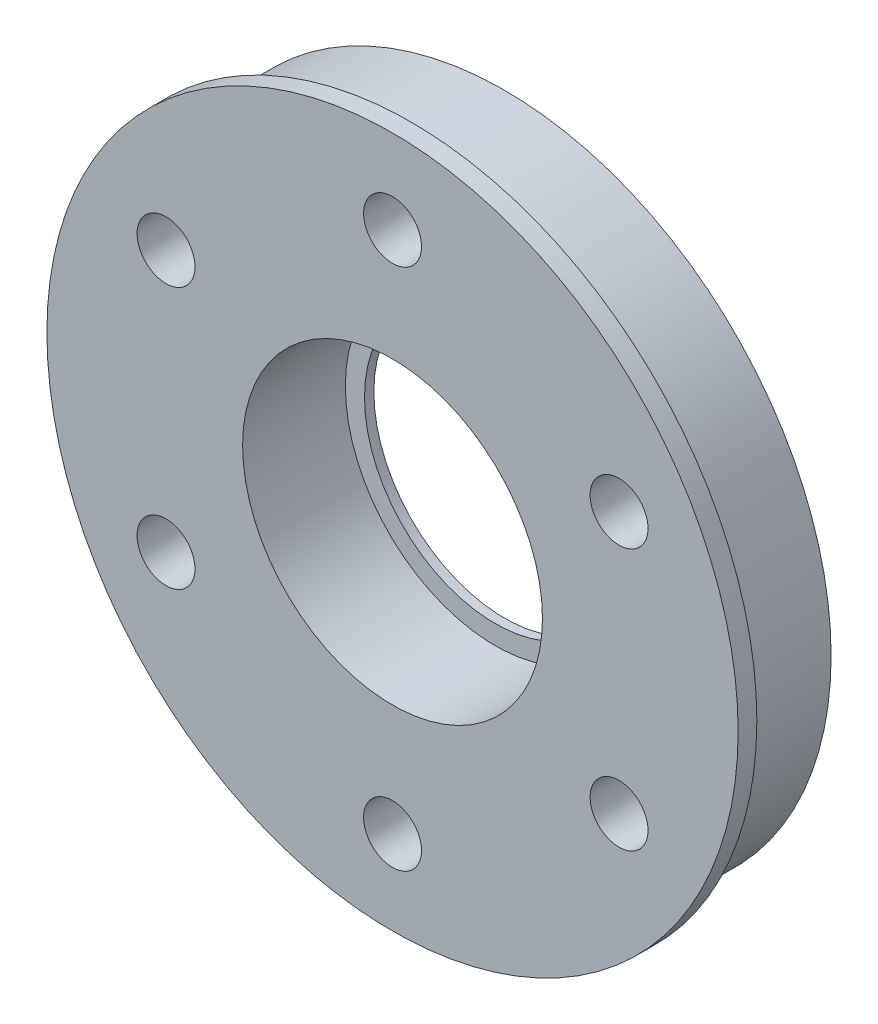
ISO-10303-21;
HEADER;
FILE_DESCRIPTION(('STEP AP214'),'2;1');
FILE_NAME('part.step','',(''),(''),'','','');
FILE_SCHEMA(('AUTOMOTIVE_DESIGN { 1 0 10303 214 1 1 1 1 }'));
ENDSEC;
DATA;
#1=APPLICATION_CONTEXT('core data for automotive mechanical design processes');
#2=APPLICATION_PROTOCOL_DEFINITION('international standard','automotive_design',2000,#1);
#3=PRODUCT_CONTEXT('',#1,'mechanical');
#4=PRODUCT('Part','Part','',(#3));
#5=PRODUCT_RELATED_PRODUCT_CATEGORY('part','',(#4));
#6=PRODUCT_DEFINITION_FORMATION('','',#4);
#7=PRODUCT_DEFINITION_CONTEXT('part definition',#1,'design');
#8=PRODUCT_DEFINITION('design','',#6,#7);
#9=PRODUCT_DEFINITION_SHAPE('','',#8);
#10=(LENGTH_UNIT() NAMED_UNIT(*) SI_UNIT(.MILLI.,.METRE.));
#11=(NAMED_UNIT(*) PLANE_ANGLE_UNIT() SI_UNIT($,.RADIAN.));
#12=(NAMED_UNIT(*) SI_UNIT($,.STERADIAN.) SOLID_ANGLE_UNIT());
#13=UNCERTAINTY_MEASURE_WITH_UNIT(LENGTH_MEASURE(1.E-05),#10,'distance_accuracy_value','');
#14=(GEOMETRIC_REPRESENTATION_CONTEXT(3) GLOBAL_UNCERTAINTY_ASSIGNED_CONTEXT((#13)) GLOBAL_UNIT_ASSIGNED_CONTEXT((#10,
#11,#12)) REPRESENTATION_CONTEXT('',''));
#15=CARTESIAN_POINT('',(0.,0.,0.));
#16=DIRECTION('',(0.,0.,1.));
#17=DIRECTION('',(1.,0.,0.));
#18=AXIS2_PLACEMENT_3D('',#15,#16,#17);
#19=CARTESIAN_POINT('',(0.,0.,6.));
#20=DIRECTION('',(0.,0.,-1.));
#21=DIRECTION('',(-1.,0.,0.));
#22=AXIS2_PLACEMENT_3D('',#19,#20,#21);
#23=CYLINDRICAL_SURFACE('',#22,17.475);
#24=CARTESIAN_POINT('',(0.,0.,0.));
#25=DIRECTION('',(0.,0.,1.));
#26=DIRECTION('',(1.,0.,0.));
#27=AXIS2_PLACEMENT_3D('',#24,#25,#26);
#28=CIRCLE('',#27,17.475);
#29=CARTESIAN_POINT('',(17.475,0.,0.));
#30=VERTEX_POINT('',#29);
#31=EDGE_CURVE('E68',#30,#30,#28,.T.);
#32=ORIENTED_EDGE('',*,*,#31,.T.);
#33=EDGE_LOOP('',(#32));
#34=FACE_BOUND('',#33,.T.);
#35=CARTESIAN_POINT('',(0.,0.,5.));
#36=DIRECTION('',(0.,0.,1.));
#37=DIRECTION('',(1.,0.,0.));
#38=AXIS2_PLACEMENT_3D('',#35,#36,#37);
#39=CIRCLE('',#38,17.475);
#40=CARTESIAN_POINT('',(17.475,0.,5.));
#41=VERTEX_POINT('',#40);
#42=EDGE_CURVE('E58',#41,#41,#39,.T.);
#43=ORIENTED_EDGE('',*,*,#42,.F.);
#44=EDGE_LOOP('',(#43));
#45=FACE_BOUND('',#44,.T.);
#46=ADVANCED_FACE('F51',(#34,#45),#23,.T.);
#47=CARTESIAN_POINT('',(0.,0.,6.));
#48=DIRECTION('',(0.,0.,-1.));
#49=DIRECTION('',(-1.,0.,0.));
#50=AXIS2_PLACEMENT_3D('',#47,#48,#49);
#51=CYLINDRICAL_SURFACE('',#50,8.025);
#52=CARTESIAN_POINT('',(0.,0.,0.5));
#53=DIRECTION('',(0.,0.,1.));
#54=DIRECTION('',(1.,0.,0.));
#55=AXIS2_PLACEMENT_3D('',#52,#53,#54);
#56=CIRCLE('',#55,8.025);
#57=CARTESIAN_POINT('',(8.025,0.,0.5));
#58=VERTEX_POINT('',#57);
#59=EDGE_CURVE('E11',#58,#58,#56,.T.);
#60=ORIENTED_EDGE('',*,*,#59,.F.);
#61=EDGE_LOOP('',(#60));
#62=FACE_BOUND('',#61,.T.);
#63=CARTESIAN_POINT('',(0.,0.,6.));
#64=DIRECTION('',(0.,0.,1.));
#65=DIRECTION('',(1.,0.,0.));
#66=AXIS2_PLACEMENT_3D('',#63,#64,#65);
#67=CIRCLE('',#66,8.025);
#68=CARTESIAN_POINT('',(8.025,0.,6.));
#69=VERTEX_POINT('',#68);
#70=EDGE_CURVE('E63',#69,#69,#67,.T.);
#71=ORIENTED_EDGE('',*,*,#70,.T.);
#72=EDGE_LOOP('',(#71));
#73=FACE_BOUND('',#72,.T.);
#74=ADVANCED_FACE('F154',(#62,#73),#51,.F.);
#75=CARTESIAN_POINT('',(0.,0.,6.));
#76=DIRECTION('',(0.,0.,1.));
#77=DIRECTION('',(1.,0.,0.));
#78=AXIS2_PLACEMENT_3D('',#75,#76,#77);
#79=PLANE('',#78);
#80=ORIENTED_EDGE('',*,*,#70,.F.);
#81=EDGE_LOOP('',(#80));
#82=FACE_BOUND('',#81,.T.);
#83=CARTESIAN_POINT('',(-12.1243556529816,6.99999999999903,6.));
#84=DIRECTION('',(0.,0.,1.));
#85=DIRECTION('',(1.,0.,0.));
#86=AXIS2_PLACEMENT_3D('',#83,#84,#85);
#87=CIRCLE('',#86,1.55);
#88=CARTESIAN_POINT('',(-10.5743556529816,6.99999999999903,6.));
#89=VERTEX_POINT('',#88);
#90=EDGE_CURVE('E75',#89,#89,#87,.T.);
#91=ORIENTED_EDGE('',*,*,#90,.F.);
#92=EDGE_LOOP('',(#91));
#93=FACE_BOUND('',#92,.T.);
#94=CARTESIAN_POINT('',(0.,14.,6.));
#95=DIRECTION('',(0.,0.,1.));
#96=DIRECTION('',(1.,0.,0.));
#97=AXIS2_PLACEMENT_3D('',#94,#95,#96);
#98=CIRCLE('',#97,1.55);
#99=CARTESIAN_POINT('',(1.55,14.,6.));
#100=VERTEX_POINT('',#99);
#101=EDGE_CURVE('E116',#100,#100,#98,.T.);
#102=ORIENTED_EDGE('',*,*,#101,.F.);
#103=EDGE_LOOP('',(#102));
#104=FACE_BOUND('',#103,.T.);
#105=CARTESIAN_POINT('',(12.1243556529827,7.00000000000096,6.));
#106=DIRECTION('',(0.,0.,1.));
#107=DIRECTION('',(1.,0.,0.));
#108=AXIS2_PLACEMENT_3D('',#105,#106,#107);
#109=CIRCLE('',#108,1.55);
#110=CARTESIAN_POINT('',(13.6743556529827,7.00000000000096,6.));
#111=VERTEX_POINT('',#110);
#112=EDGE_CURVE('E108',#111,#111,#109,.T.);
#113=ORIENTED_EDGE('',*,*,#112,.F.);
#114=EDGE_LOOP('',(#113));
#115=FACE_BOUND('',#114,.T.);
#116=CARTESIAN_POINT('',(12.1243556529838,-6.99999999999904,6.));
#117=DIRECTION('',(0.,0.,1.));
#118=DIRECTION('',(1.,0.,0.));
#119=AXIS2_PLACEMENT_3D('',#116,#117,#118);
#120=CIRCLE('',#119,1.55);
#121=CARTESIAN_POINT('',(13.6743556529838,-6.99999999999904,6.));
#122=VERTEX_POINT('',#121);
#123=EDGE_CURVE('E100',#122,#122,#120,.T.);
#124=ORIENTED_EDGE('',*,*,#123,.F.);
#125=EDGE_LOOP('',(#124));
#126=FACE_BOUND('',#125,.T.);
#127=CARTESIAN_POINT('',(2.21223967773475E-12,-14.,6.));
#128=DIRECTION('',(0.,0.,1.));
#129=DIRECTION('',(1.,0.,0.));
#130=AXIS2_PLACEMENT_3D('',#127,#128,#129);
#131=CIRCLE('',#130,1.55);
#132=CARTESIAN_POINT('',(1.55000000000221,-14.,6.));
#133=VERTEX_POINT('',#132);
#134=EDGE_CURVE('E92',#133,#133,#131,.T.);
#135=ORIENTED_EDGE('',*,*,#134,.F.);
#136=EDGE_LOOP('',(#135));
#137=FACE_BOUND('',#136,.T.);
#138=CARTESIAN_POINT('',(-12.1243556529805,-7.00000000000096,6.));
#139=DIRECTION('',(0.,0.,1.));
#140=DIRECTION('',(1.,0.,0.));
#141=AXIS2_PLACEMENT_3D('',#138,#139,#140);
#142=CIRCLE('',#141,1.55);
#143=CARTESIAN_POINT('',(-10.5743556529805,-7.00000000000096,6.));
#144=VERTEX_POINT('',#143);
#145=EDGE_CURVE('E83',#144,#144,#142,.T.);
#146=ORIENTED_EDGE('',*,*,#145,.F.);
#147=EDGE_LOOP('',(#146));
#148=FACE_BOUND('',#147,.T.);
#149=CARTESIAN_POINT('',(0.,0.,6.));
#150=DIRECTION('',(0.,0.,1.));
#151=DIRECTION('',(1.,0.,0.));
#152=AXIS2_PLACEMENT_3D('',#149,#150,#151);
#153=CIRCLE('',#152,18.5);
#154=CARTESIAN_POINT('',(18.5,0.,6.));
#155=VERTEX_POINT('',#154);
#156=EDGE_CURVE('E123',#155,#155,#153,.T.);
#157=ORIENTED_EDGE('',*,*,#156,.T.);
#158=EDGE_LOOP('',(#157));
#159=FACE_BOUND('',#158,.T.);
#160=ADVANCED_FACE('F159',(#82,#93,#104,#115,#126,#137,#148,#159),#79,.T.);
#161=CARTESIAN_POINT('',(0.,0.,0.));
#162=DIRECTION('',(0.,0.,1.));
#163=DIRECTION('',(1.,0.,0.));
#164=AXIS2_PLACEMENT_3D('',#161,#162,#163);
#165=PLANE('',#164);
#166=ORIENTED_EDGE('',*,*,#31,.F.);
#167=EDGE_LOOP('',(#166));
#168=FACE_BOUND('',#167,.T.);
#169=CARTESIAN_POINT('',(0.,0.,0.));
#170=DIRECTION('',(0.,0.,1.));
#171=DIRECTION('',(1.,0.,0.));
#172=AXIS2_PLACEMENT_3D('',#169,#170,#171);
#173=CIRCLE('',#172,7.);
#174=CARTESIAN_POINT('',(7.,0.,0.));
#175=VERTEX_POINT('',#174);
#176=EDGE_CURVE('E131',#175,#175,#173,.T.);
#177=ORIENTED_EDGE('',*,*,#176,.T.);
#178=EDGE_LOOP('',(#177));
#179=FACE_BOUND('',#178,.T.);
#180=ADVANCED_FACE('F164',(#168,#179),#165,.F.);
#181=CARTESIAN_POINT('',(-12.1243556529816,6.99999999999903,2.));
#182=DIRECTION('',(0.,0.,1.));
#183=DIRECTION('',(1.,0.,0.));
#184=AXIS2_PLACEMENT_3D('',#181,#182,#183);
#185=CYLINDRICAL_SURFACE('',#184,1.55);
#186=CARTESIAN_POINT('',(-12.1243556529816,6.99999999999903,2.));
#187=DIRECTION('',(0.,0.,1.));
#188=DIRECTION('',(1.,0.,0.));
#189=AXIS2_PLACEMENT_3D('',#186,#187,#188);
#190=CIRCLE('',#189,1.55);
#191=CARTESIAN_POINT('',(-10.5743556529816,6.99999999999903,2.));
#192=VERTEX_POINT('',#191);
#193=EDGE_CURVE('E73',#192,#192,#190,.T.);
#194=ORIENTED_EDGE('',*,*,#193,.F.);
#195=EDGE_LOOP('',(#194));
#196=FACE_BOUND('',#195,.T.);
#197=ORIENTED_EDGE('',*,*,#90,.T.);
#198=EDGE_LOOP('',(#197));
#199=FACE_BOUND('',#198,.T.);
#200=ADVANCED_FACE('F167',(#196,#199),#185,.F.);
#201=CARTESIAN_POINT('',(-12.1243556529816,6.99999999999903,2.));
#202=DIRECTION('',(0.,0.,1.));
#203=DIRECTION('',(1.,0.,0.));
#204=AXIS2_PLACEMENT_3D('',#201,#202,#203);
#205=PLANE('',#204);
#206=ORIENTED_EDGE('',*,*,#193,.T.);
#207=EDGE_LOOP('',(#206));
#208=FACE_BOUND('',#207,.T.);
#209=ADVANCED_FACE('F174',(#208),#205,.T.);
#210=CARTESIAN_POINT('',(0.,14.,2.));
#211=DIRECTION('',(0.,0.,1.));
#212=DIRECTION('',(1.,0.,0.));
#213=AXIS2_PLACEMENT_3D('',#210,#211,#212);
#214=CYLINDRICAL_SURFACE('',#213,1.55);
#215=CARTESIAN_POINT('',(0.,14.,2.));
#216=DIRECTION('',(0.,0.,1.));
#217=DIRECTION('',(1.,0.,0.));
#218=AXIS2_PLACEMENT_3D('',#215,#216,#217);
#219=CIRCLE('',#218,1.55);
#220=CARTESIAN_POINT('',(1.55,14.,2.));
#221=VERTEX_POINT('',#220);
#222=EDGE_CURVE('E79',#221,#221,#219,.T.);
#223=ORIENTED_EDGE('',*,*,#222,.F.);
#224=EDGE_LOOP('',(#223));
#225=FACE_BOUND('',#224,.T.);
#226=ORIENTED_EDGE('',*,*,#101,.T.);
#227=EDGE_LOOP('',(#226));
#228=FACE_BOUND('',#227,.T.);
#229=ADVANCED_FACE('F182',(#225,#228),#214,.F.);
#230=CARTESIAN_POINT('',(0.,14.,2.));
#231=DIRECTION('',(0.,0.,1.));
#232=DIRECTION('',(1.,0.,0.));
#233=AXIS2_PLACEMENT_3D('',#230,#231,#232);
#234=PLANE('',#233);
#235=ORIENTED_EDGE('',*,*,#222,.T.);
#236=EDGE_LOOP('',(#235));
#237=FACE_BOUND('',#236,.T.);
#238=ADVANCED_FACE('F212',(#237),#234,.T.);
#239=CARTESIAN_POINT('',(12.1243556529827,7.00000000000096,2.));
#240=DIRECTION('',(0.,0.,1.));
#241=DIRECTION('',(1.,0.,0.));
#242=AXIS2_PLACEMENT_3D('',#239,#240,#241);
#243=CYLINDRICAL_SURFACE('',#242,1.55);
#244=CARTESIAN_POINT('',(12.1243556529827,7.00000000000096,2.));
#245=DIRECTION('',(0.,0.,1.));
#246=DIRECTION('',(1.,0.,0.));
#247=AXIS2_PLACEMENT_3D('',#244,#245,#246);
#248=CIRCLE('',#247,1.55);
#249=CARTESIAN_POINT('',(13.6743556529827,7.00000000000096,2.));
#250=VERTEX_POINT('',#249);
#251=EDGE_CURVE('E112',#250,#250,#248,.T.);
#252=ORIENTED_EDGE('',*,*,#251,.F.);
#253=EDGE_LOOP('',(#252));
#254=FACE_BOUND('',#253,.T.);
#255=ORIENTED_EDGE('',*,*,#112,.T.);
#256=EDGE_LOOP('',(#255));
#257=FACE_BOUND('',#256,.T.);
#258=ADVANCED_FACE('F209',(#254,#257),#243,.F.);
#259=CARTESIAN_POINT('',(12.1243556529827,7.00000000000096,2.));
#260=DIRECTION('',(0.,0.,1.));
#261=DIRECTION('',(1.,0.,0.));
#262=AXIS2_PLACEMENT_3D('',#259,#260,#261);
#263=PLANE('',#262);
#264=ORIENTED_EDGE('',*,*,#251,.T.);
#265=EDGE_LOOP('',(#264));
#266=FACE_BOUND('',#265,.T.);
#267=ADVANCED_FACE('F204',(#266),#263,.T.);
#268=CARTESIAN_POINT('',(12.1243556529838,-6.99999999999904,2.));
#269=DIRECTION('',(0.,0.,1.));
#270=DIRECTION('',(1.,0.,0.));
#271=AXIS2_PLACEMENT_3D('',#268,#269,#270);
#272=CYLINDRICAL_SURFACE('',#271,1.55);
#273=CARTESIAN_POINT('',(12.1243556529838,-6.99999999999904,2.));
#274=DIRECTION('',(0.,0.,1.));
#275=DIRECTION('',(1.,0.,0.));
#276=AXIS2_PLACEMENT_3D('',#273,#274,#275);
#277=CIRCLE('',#276,1.55);
#278=CARTESIAN_POINT('',(13.6743556529838,-6.99999999999904,2.));
#279=VERTEX_POINT('',#278);
#280=EDGE_CURVE('E104',#279,#279,#277,.T.);
#281=ORIENTED_EDGE('',*,*,#280,.F.);
#282=EDGE_LOOP('',(#281));
#283=FACE_BOUND('',#282,.T.);
#284=ORIENTED_EDGE('',*,*,#123,.T.);
#285=EDGE_LOOP('',(#284));
#286=FACE_BOUND('',#285,.T.);
#287=ADVANCED_FACE('F201',(#283,#286),#272,.F.);
#288=CARTESIAN_POINT('',(12.1243556529838,-6.99999999999904,2.));
#289=DIRECTION('',(0.,0.,1.));
#290=DIRECTION('',(1.,0.,0.));
#291=AXIS2_PLACEMENT_3D('',#288,#289,#290);
#292=PLANE('',#291);
#293=ORIENTED_EDGE('',*,*,#280,.T.);
#294=EDGE_LOOP('',(#293));
#295=FACE_BOUND('',#294,.T.);
#296=ADVANCED_FACE('F196',(#295),#292,.T.);
#297=CARTESIAN_POINT('',(2.21223967773475E-12,-14.,2.));
#298=DIRECTION('',(0.,0.,1.));
#299=DIRECTION('',(1.,0.,0.));
#300=AXIS2_PLACEMENT_3D('',#297,#298,#299);
#301=CYLINDRICAL_SURFACE('',#300,1.55);
#302=CARTESIAN_POINT('',(2.21223967773475E-12,-14.,2.));
#303=DIRECTION('',(0.,0.,1.));
#304=DIRECTION('',(1.,0.,0.));
#305=AXIS2_PLACEMENT_3D('',#302,#303,#304);
#306=CIRCLE('',#305,1.55);
#307=CARTESIAN_POINT('',(1.55000000000221,-14.,2.));
#308=VERTEX_POINT('',#307);
#309=EDGE_CURVE('E96',#308,#308,#306,.T.);
#310=ORIENTED_EDGE('',*,*,#309,.F.);
#311=EDGE_LOOP('',(#310));
#312=FACE_BOUND('',#311,.T.);
#313=ORIENTED_EDGE('',*,*,#134,.T.);
#314=EDGE_LOOP('',(#313));
#315=FACE_BOUND('',#314,.T.);
#316=ADVANCED_FACE('F193',(#312,#315),#301,.F.);
#317=CARTESIAN_POINT('',(2.21223967773475E-12,-14.,2.));
#318=DIRECTION('',(0.,0.,1.));
#319=DIRECTION('',(1.,0.,0.));
#320=AXIS2_PLACEMENT_3D('',#317,#318,#319);
#321=PLANE('',#320);
#322=ORIENTED_EDGE('',*,*,#309,.T.);
#323=EDGE_LOOP('',(#322));
#324=FACE_BOUND('',#323,.T.);
#325=ADVANCED_FACE('F188',(#324),#321,.T.);
#326=CARTESIAN_POINT('',(-12.1243556529805,-7.00000000000096,2.));
#327=DIRECTION('',(0.,0.,1.));
#328=DIRECTION('',(1.,0.,0.));
#329=AXIS2_PLACEMENT_3D('',#326,#327,#328);
#330=CYLINDRICAL_SURFACE('',#329,1.55);
#331=CARTESIAN_POINT('',(-12.1243556529805,-7.00000000000096,2.));
#332=DIRECTION('',(0.,0.,1.));
#333=DIRECTION('',(1.,0.,0.));
#334=AXIS2_PLACEMENT_3D('',#331,#332,#333);
#335=CIRCLE('',#334,1.55);
#336=CARTESIAN_POINT('',(-10.5743556529805,-7.00000000000096,2.));
#337=VERTEX_POINT('',#336);
#338=EDGE_CURVE('E87',#337,#337,#335,.T.);
#339=ORIENTED_EDGE('',*,*,#338,.F.);
#340=EDGE_LOOP('',(#339));
#341=FACE_BOUND('',#340,.T.);
#342=ORIENTED_EDGE('',*,*,#145,.T.);
#343=EDGE_LOOP('',(#342));
#344=FACE_BOUND('',#343,.T.);
#345=ADVANCED_FACE('F184',(#341,#344),#330,.F.);
#346=CARTESIAN_POINT('',(-12.1243556529805,-7.00000000000096,2.));
#347=DIRECTION('',(0.,0.,1.));
#348=DIRECTION('',(1.,0.,0.));
#349=AXIS2_PLACEMENT_3D('',#346,#347,#348);
#350=PLANE('',#349);
#351=ORIENTED_EDGE('',*,*,#338,.T.);
#352=EDGE_LOOP('',(#351));
#353=FACE_BOUND('',#352,.T.);
#354=ADVANCED_FACE('F187',(#353),#350,.T.);
#355=CARTESIAN_POINT('',(0.,0.,5.));
#356=DIRECTION('',(0.,0.,1.));
#357=DIRECTION('',(1.,0.,0.));
#358=AXIS2_PLACEMENT_3D('',#355,#356,#357);
#359=CYLINDRICAL_SURFACE('',#358,18.5);
#360=CARTESIAN_POINT('',(0.,0.,5.));
#361=DIRECTION('',(0.,0.,1.));
#362=DIRECTION('',(1.,0.,0.));
#363=AXIS2_PLACEMENT_3D('',#360,#361,#362);
#364=CIRCLE('',#363,18.5);
#365=CARTESIAN_POINT('',(18.5,0.,5.));
#366=VERTEX_POINT('',#365);
#367=EDGE_CURVE('E88',#366,#366,#364,.T.);
#368=ORIENTED_EDGE('',*,*,#367,.T.);
#369=EDGE_LOOP('',(#368));
#370=FACE_BOUND('',#369,.T.);
#371=ORIENTED_EDGE('',*,*,#156,.F.);
#372=EDGE_LOOP('',(#371));
#373=FACE_BOUND('',#372,.T.);
#374=ADVANCED_FACE('F151',(#370,#373),#359,.T.);
#375=CARTESIAN_POINT('',(0.,0.,5.));
#376=DIRECTION('',(0.,0.,1.));
#377=DIRECTION('',(1.,0.,0.));
#378=AXIS2_PLACEMENT_3D('',#375,#376,#377);
#379=PLANE('',#378);
#380=ORIENTED_EDGE('',*,*,#42,.T.);
#381=EDGE_LOOP('',(#380));
#382=FACE_BOUND('',#381,.T.);
#383=ORIENTED_EDGE('',*,*,#367,.F.);
#384=EDGE_LOOP('',(#383));
#385=FACE_BOUND('',#384,.T.);
#386=ADVANCED_FACE('F144',(#382,#385),#379,.F.);
#387=CARTESIAN_POINT('',(0.,0.,0.5));
#388=DIRECTION('',(0.,0.,1.));
#389=DIRECTION('',(1.,0.,0.));
#390=AXIS2_PLACEMENT_3D('',#387,#388,#389);
#391=PLANE('',#390);
#392=CARTESIAN_POINT('',(0.,0.,0.5));
#393=DIRECTION('',(0.,0.,1.));
#394=DIRECTION('',(1.,0.,0.));
#395=AXIS2_PLACEMENT_3D('',#392,#393,#394);
#396=CIRCLE('',#395,7.);
#397=CARTESIAN_POINT('',(7.,0.,0.5));
#398=VERTEX_POINT('',#397);
#399=EDGE_CURVE('E127',#398,#398,#396,.T.);
#400=ORIENTED_EDGE('',*,*,#399,.F.);
#401=EDGE_LOOP('',(#400));
#402=FACE_BOUND('',#401,.T.);
#403=ORIENTED_EDGE('',*,*,#59,.T.);
#404=EDGE_LOOP('',(#403));
#405=FACE_BOUND('',#404,.T.);
#406=ADVANCED_FACE('F142',(#402,#405),#391,.T.);
#407=CARTESIAN_POINT('',(0.,0.,0.5));
#408=DIRECTION('',(0.,0.,-1.));
#409=DIRECTION('',(-1.,0.,0.));
#410=AXIS2_PLACEMENT_3D('',#407,#408,#409);
#411=CYLINDRICAL_SURFACE('',#410,7.);
#412=ORIENTED_EDGE('',*,*,#399,.T.);
#413=EDGE_LOOP('',(#412));
#414=FACE_BOUND('',#413,.T.);
#415=ORIENTED_EDGE('',*,*,#176,.F.);
#416=EDGE_LOOP('',(#415));
#417=FACE_BOUND('',#416,.T.);
#418=ADVANCED_FACE('F139',(#414,#417),#411,.F.);
#419=CLOSED_SHELL('',(#46,#74,#160,#180,#200,#209,#229,#238,#258,#267,#287,#296,#316,#325,#345,
#354,#374,#386,#406,#418));
#420=MANIFOLD_SOLID_BREP('B2',#419);
#421=ADVANCED_BREP_SHAPE_REPRESENTATION('',(#18,#420),#14);
#422=SHAPE_DEFINITION_REPRESENTATION(#9,#421);
ENDSEC;
END-ISO-10303-21;
